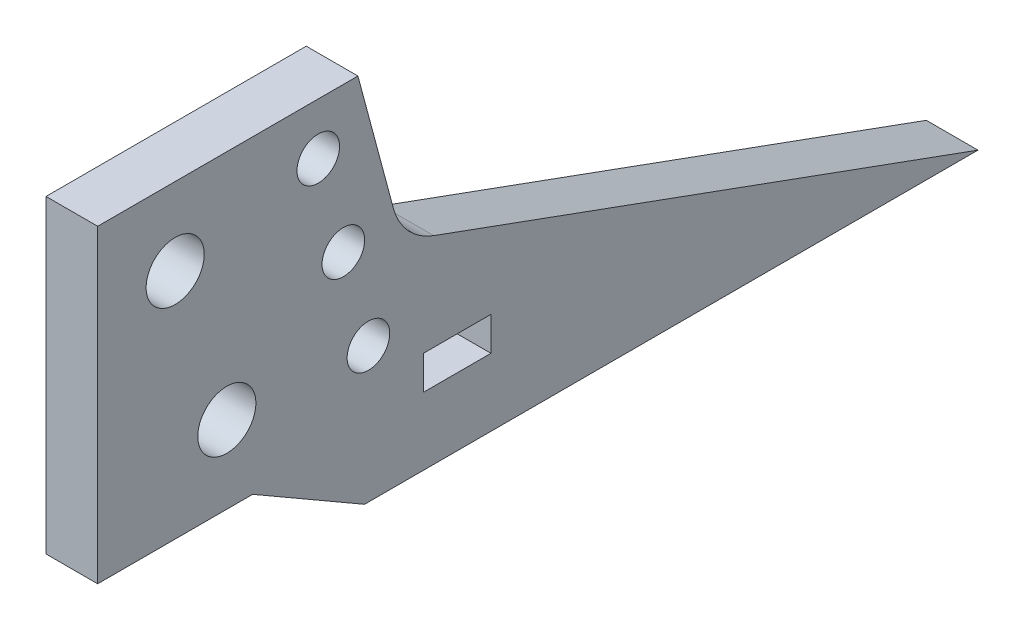
ISO-10303-21;
HEADER;
FILE_DESCRIPTION(('STEP AP214'),'2;1');
FILE_NAME('part.step','',(''),(''),'','','');
FILE_SCHEMA(('AUTOMOTIVE_DESIGN { 1 0 10303 214 1 1 1 1 }'));
ENDSEC;
DATA;
#1=APPLICATION_CONTEXT('core data for automotive mechanical design processes');
#2=APPLICATION_PROTOCOL_DEFINITION('international standard','automotive_design',2000,#1);
#3=PRODUCT_CONTEXT('',#1,'mechanical');
#4=PRODUCT('Part','Part','',(#3));
#5=PRODUCT_RELATED_PRODUCT_CATEGORY('part','',(#4));
#6=PRODUCT_DEFINITION_FORMATION('','',#4);
#7=PRODUCT_DEFINITION_CONTEXT('part definition',#1,'design');
#8=PRODUCT_DEFINITION('design','',#6,#7);
#9=PRODUCT_DEFINITION_SHAPE('','',#8);
#10=(LENGTH_UNIT() NAMED_UNIT(*) SI_UNIT(.MILLI.,.METRE.));
#11=(NAMED_UNIT(*) PLANE_ANGLE_UNIT() SI_UNIT($,.RADIAN.));
#12=(NAMED_UNIT(*) SI_UNIT($,.STERADIAN.) SOLID_ANGLE_UNIT());
#13=UNCERTAINTY_MEASURE_WITH_UNIT(LENGTH_MEASURE(1.E-05),#10,'distance_accuracy_value','');
#14=(GEOMETRIC_REPRESENTATION_CONTEXT(3) GLOBAL_UNCERTAINTY_ASSIGNED_CONTEXT((#13)) GLOBAL_UNIT_ASSIGNED_CONTEXT((#10,
#11,#12)) REPRESENTATION_CONTEXT('',''));
#15=CARTESIAN_POINT('',(0.,0.,0.));
#16=DIRECTION('',(0.,0.,1.));
#17=DIRECTION('',(1.,0.,0.));
#18=AXIS2_PLACEMENT_3D('',#15,#16,#17);
#19=CARTESIAN_POINT('',(8.,10.,-16.));
#20=DIRECTION('',(0.,1.,0.));
#21=DIRECTION('',(0.,0.,1.));
#22=AXIS2_PLACEMENT_3D('',#19,#20,#21);
#23=PLANE('',#22);
#24=DIRECTION('',(0.,0.,-1.));
#25=VECTOR('',#24,1.);
#26=CARTESIAN_POINT('',(0.,10.,-16.));
#27=LINE('',#26,#25);
#28=CARTESIAN_POINT('',(0.,9.99999999999999,7.99999999999999));
#29=VERTEX_POINT('',#28);
#30=CARTESIAN_POINT('',(0.,10.,-16.));
#31=VERTEX_POINT('',#30);
#32=EDGE_CURVE('E238',#29,#31,#27,.T.);
#33=ORIENTED_EDGE('',*,*,#32,.T.);
#34=DIRECTION('',(-1.,0.,0.));
#35=VECTOR('',#34,1.);
#36=CARTESIAN_POINT('',(8.,10.,-16.));
#37=LINE('',#36,#35);
#38=CARTESIAN_POINT('',(8.,10.,-16.));
#39=VERTEX_POINT('',#38);
#40=EDGE_CURVE('E278',#39,#31,#37,.T.);
#41=ORIENTED_EDGE('',*,*,#40,.F.);
#42=DIRECTION('',(0.,0.,-1.));
#43=VECTOR('',#42,1.);
#44=CARTESIAN_POINT('',(8.,10.,-16.));
#45=LINE('',#44,#43);
#46=CARTESIAN_POINT('',(8.,9.99999999999999,7.99999999999999));
#47=VERTEX_POINT('',#46);
#48=EDGE_CURVE('E239',#47,#39,#45,.T.);
#49=ORIENTED_EDGE('',*,*,#48,.F.);
#50=DIRECTION('',(1.,0.,0.));
#51=VECTOR('',#50,1.);
#52=CARTESIAN_POINT('',(-48.6149330272285,9.99999999999999,7.99999999999999));
#53=LINE('',#52,#51);
#54=EDGE_CURVE('E219',#29,#47,#53,.T.);
#55=ORIENTED_EDGE('',*,*,#54,.F.);
#56=EDGE_LOOP('',(#33,#41,#49,#55));
#57=FACE_BOUND('',#56,.T.);
#58=ADVANCED_FACE('F45',(#57),#23,.F.);
#59=CARTESIAN_POINT('',(8.,0.,-33.3205080756887));
#60=DIRECTION('',(0.,0.866025403784438,-0.500000000000001));
#61=DIRECTION('',(0.,0.500000000000001,0.866025403784438));
#62=AXIS2_PLACEMENT_3D('',#59,#60,#61);
#63=PLANE('',#62);
#64=DIRECTION('',(0.,-0.500000000000001,-0.866025403784438));
#65=VECTOR('',#64,1.);
#66=CARTESIAN_POINT('',(0.,0.,-33.3205080756887));
#67=LINE('',#66,#65);
#68=CARTESIAN_POINT('',(0.,0.,-33.3205080756887));
#69=VERTEX_POINT('',#68);
#70=EDGE_CURVE('E259',#31,#69,#67,.T.);
#71=ORIENTED_EDGE('',*,*,#70,.T.);
#72=DIRECTION('',(-1.,0.,0.));
#73=VECTOR('',#72,1.);
#74=CARTESIAN_POINT('',(8.,0.,-33.3205080756887));
#75=LINE('',#74,#73);
#76=CARTESIAN_POINT('',(8.,0.,-33.3205080756887));
#77=VERTEX_POINT('',#76);
#78=EDGE_CURVE('E274',#77,#69,#75,.T.);
#79=ORIENTED_EDGE('',*,*,#78,.F.);
#80=DIRECTION('',(0.,-0.500000000000001,-0.866025403784438));
#81=VECTOR('',#80,1.);
#82=CARTESIAN_POINT('',(8.,0.,-33.3205080756887));
#83=LINE('',#82,#81);
#84=EDGE_CURVE('E242',#39,#77,#83,.T.);
#85=ORIENTED_EDGE('',*,*,#84,.F.);
#86=ORIENTED_EDGE('',*,*,#40,.T.);
#87=EDGE_LOOP('',(#71,#79,#85,#86));
#88=FACE_BOUND('',#87,.T.);
#89=ADVANCED_FACE('F322',(#88),#63,.F.);
#90=CARTESIAN_POINT('',(8.,0.,-33.3205080756887));
#91=DIRECTION('',(0.,1.,0.));
#92=DIRECTION('',(0.,0.,1.));
#93=AXIS2_PLACEMENT_3D('',#90,#91,#92);
#94=PLANE('',#93);
#95=DIRECTION('',(0.,0.,-1.));
#96=VECTOR('',#95,1.);
#97=CARTESIAN_POINT('',(0.,0.,-33.3205080756887));
#98=LINE('',#97,#96);
#99=CARTESIAN_POINT('',(0.,0.,-128.320508075689));
#100=VERTEX_POINT('',#99);
#101=EDGE_CURVE('E262',#69,#100,#98,.T.);
#102=ORIENTED_EDGE('',*,*,#101,.T.);
#103=DIRECTION('',(-1.,0.,0.));
#104=VECTOR('',#103,1.);
#105=CARTESIAN_POINT('',(8.,0.,-128.320508075689));
#106=LINE('',#105,#104);
#107=CARTESIAN_POINT('',(8.,0.,-128.320508075689));
#108=VERTEX_POINT('',#107);
#109=EDGE_CURVE('E256',#108,#100,#106,.T.);
#110=ORIENTED_EDGE('',*,*,#109,.F.);
#111=DIRECTION('',(0.,0.,-1.));
#112=VECTOR('',#111,1.);
#113=CARTESIAN_POINT('',(8.,0.,-33.3205080756887));
#114=LINE('',#113,#112);
#115=EDGE_CURVE('E246',#77,#108,#114,.T.);
#116=ORIENTED_EDGE('',*,*,#115,.F.);
#117=ORIENTED_EDGE('',*,*,#78,.T.);
#118=EDGE_LOOP('',(#102,#110,#116,#117));
#119=FACE_BOUND('',#118,.T.);
#120=ADVANCED_FACE('F325',(#119),#94,.F.);
#121=CARTESIAN_POINT('',(8.,0.,-128.320508075689));
#122=DIRECTION('',(0.,-0.939692620785911,0.342020143325663));
#123=DIRECTION('',(0.,-0.342020143325663,-0.939692620785911));
#124=AXIS2_PLACEMENT_3D('',#121,#122,#123);
#125=PLANE('',#124);
#126=DIRECTION('',(0.,0.342020143325663,0.939692620785911));
#127=VECTOR('',#126,1.);
#128=CARTESIAN_POINT('',(0.,0.,-128.320508075689));
#129=LINE('',#128,#127);
#130=CARTESIAN_POINT('',(0.,30.6822908586107,-44.0216067645152));
#131=VERTEX_POINT('',#130);
#132=EDGE_CURVE('E265',#100,#131,#129,.T.);
#133=ORIENTED_EDGE('',*,*,#132,.T.);
#134=DIRECTION('',(-1.,0.,0.));
#135=VECTOR('',#134,1.);
#136=CARTESIAN_POINT('',(8.,30.6822908586107,-44.0216067645152));
#137=LINE('',#136,#135);
#138=CARTESIAN_POINT('',(8.,30.6822908586107,-44.0216067645152));
#139=VERTEX_POINT('',#138);
#140=EDGE_CURVE('E286',#131,#139,#137,.F.);
#141=ORIENTED_EDGE('',*,*,#140,.T.);
#142=DIRECTION('',(0.,0.342020143325663,0.939692620785911));
#143=VECTOR('',#142,1.);
#144=CARTESIAN_POINT('',(8.,0.,-128.320508075689));
#145=LINE('',#144,#143);
#146=EDGE_CURVE('E249',#108,#139,#145,.T.);
#147=ORIENTED_EDGE('',*,*,#146,.F.);
#148=ORIENTED_EDGE('',*,*,#109,.T.);
#149=EDGE_LOOP('',(#133,#141,#147,#148));
#150=FACE_BOUND('',#149,.T.);
#151=ADVANCED_FACE('F298',(#150),#125,.F.);
#152=CARTESIAN_POINT('',(8.,74.,-28.));
#153=DIRECTION('',(0.,-0.258819045102525,0.965925826289067));
#154=DIRECTION('',(0.,-0.965925826289067,-0.258819045102525));
#155=AXIS2_PLACEMENT_3D('',#152,#153,#154);
#156=PLANE('',#155);
#157=DIRECTION('',(0.,0.965925826289067,0.258819045102525));
#158=VECTOR('',#157,1.);
#159=CARTESIAN_POINT('',(8.,74.,-28.));
#160=LINE('',#159,#158);
#161=CARTESIAN_POINT('',(8.,37.4910266154445,-37.7825499348812));
#162=VERTEX_POINT('',#161);
#163=CARTESIAN_POINT('',(8.,57.9521815274541,-32.3));
#164=VERTEX_POINT('',#163);
#165=EDGE_CURVE('E253',#162,#164,#160,.T.);
#166=ORIENTED_EDGE('',*,*,#165,.F.);
#167=DIRECTION('',(-1.,0.,0.));
#168=VECTOR('',#167,1.);
#169=CARTESIAN_POINT('',(0.,37.4910266154445,-37.7825499348812));
#170=LINE('',#169,#168);
#171=CARTESIAN_POINT('',(0.,37.4910266154445,-37.7825499348812));
#172=VERTEX_POINT('',#171);
#173=EDGE_CURVE('E282',#162,#172,#170,.T.);
#174=ORIENTED_EDGE('',*,*,#173,.T.);
#175=DIRECTION('',(0.,0.965925826289067,0.258819045102525));
#176=VECTOR('',#175,1.);
#177=CARTESIAN_POINT('',(0.,74.,-28.));
#178=LINE('',#177,#176);
#179=CARTESIAN_POINT('',(0.,57.9521815274541,-32.3));
#180=VERTEX_POINT('',#179);
#181=EDGE_CURVE('E243',#172,#180,#178,.T.);
#182=ORIENTED_EDGE('',*,*,#181,.T.);
#183=DIRECTION('',(1.,0.,0.));
#184=VECTOR('',#183,1.);
#185=CARTESIAN_POINT('',(0.,57.9521815274541,-32.3));
#186=LINE('',#185,#184);
#187=EDGE_CURVE('E231',#180,#164,#186,.T.);
#188=ORIENTED_EDGE('',*,*,#187,.T.);
#189=EDGE_LOOP('',(#166,#174,#182,#188));
#190=FACE_BOUND('',#189,.T.);
#191=ADVANCED_FACE('F306',(#190),#156,.F.);
#192=CARTESIAN_POINT('',(8.,0.,0.));
#193=DIRECTION('',(-1.,0.,0.));
#194=DIRECTION('',(0.,0.,1.));
#195=AXIS2_PLACEMENT_3D('',#192,#193,#194);
#196=PLANE('',#195);
#197=DIRECTION('',(0.,0.,-1.));
#198=VECTOR('',#197,1.);
#199=CARTESIAN_POINT('',(8.,10.4639018828817,-42.4466301675452));
#200=LINE('',#199,#198);
#201=CARTESIAN_POINT('',(8.,10.4639018828817,-42.4466301675452));
#202=VERTEX_POINT('',#201);
#203=CARTESIAN_POINT('',(8.,10.4639018828817,-52.9005721237873));
#204=VERTEX_POINT('',#203);
#205=EDGE_CURVE('E161',#202,#204,#200,.T.);
#206=ORIENTED_EDGE('',*,*,#205,.F.);
#207=DIRECTION('',(0.,-1.,0.));
#208=VECTOR('',#207,1.);
#209=CARTESIAN_POINT('',(8.,10.4639018828817,-42.4466301675452));
#210=LINE('',#209,#208);
#211=CARTESIAN_POINT('',(8.,15.6908728610027,-42.4466301675452));
#212=VERTEX_POINT('',#211);
#213=EDGE_CURVE('E61',#212,#202,#210,.T.);
#214=ORIENTED_EDGE('',*,*,#213,.F.);
#215=DIRECTION('',(0.,0.,1.));
#216=VECTOR('',#215,1.);
#217=CARTESIAN_POINT('',(8.,15.6908728610027,-42.4466301675452));
#218=LINE('',#217,#216);
#219=CARTESIAN_POINT('',(8.,15.6908728610027,-52.9005721237873));
#220=VERTEX_POINT('',#219);
#221=EDGE_CURVE('E152',#220,#212,#218,.T.);
#222=ORIENTED_EDGE('',*,*,#221,.F.);
#223=DIRECTION('',(0.,1.,0.));
#224=VECTOR('',#223,1.);
#225=CARTESIAN_POINT('',(8.,10.4639018828817,-52.9005721237873));
#226=LINE('',#225,#224);
#227=EDGE_CURVE('E155',#204,#220,#226,.T.);
#228=ORIENTED_EDGE('',*,*,#227,.F.);
#229=EDGE_LOOP('',(#206,#214,#222,#228));
#230=FACE_BOUND('',#229,.T.);
#231=CARTESIAN_POINT('',(8.,49.9521815274541,-26.1613840961684));
#232=DIRECTION('',(1.,0.,0.));
#233=DIRECTION('',(0.,0.,-1.));
#234=AXIS2_PLACEMENT_3D('',#231,#232,#233);
#235=CIRCLE('',#234,3.3);
#236=CARTESIAN_POINT('',(8.,49.9521815274541,-29.4613840961684));
#237=VERTEX_POINT('',#236);
#238=EDGE_CURVE('E167',#237,#237,#235,.T.);
#239=ORIENTED_EDGE('',*,*,#238,.F.);
#240=EDGE_LOOP('',(#239));
#241=FACE_BOUND('',#240,.T.);
#242=CARTESIAN_POINT('',(8.,35.4632941331181,-30.0436697727062));
#243=DIRECTION('',(1.,0.,0.));
#244=DIRECTION('',(0.,0.,-1.));
#245=AXIS2_PLACEMENT_3D('',#242,#243,#244);
#246=CIRCLE('',#245,3.3);
#247=CARTESIAN_POINT('',(8.,35.4632941331181,-33.3436697727062));
#248=VERTEX_POINT('',#247);
#249=EDGE_CURVE('E178',#248,#248,#246,.T.);
#250=ORIENTED_EDGE('',*,*,#249,.F.);
#251=EDGE_LOOP('',(#250));
#252=FACE_BOUND('',#251,.T.);
#253=CARTESIAN_POINT('',(8.,20.9744067387821,-33.925955449244));
#254=DIRECTION('',(1.,0.,0.));
#255=DIRECTION('',(0.,0.,-1.));
#256=AXIS2_PLACEMENT_3D('',#253,#254,#255);
#257=CIRCLE('',#256,3.3);
#258=CARTESIAN_POINT('',(8.,20.9744067387821,-37.225955449244));
#259=VERTEX_POINT('',#258);
#260=EDGE_CURVE('E186',#259,#259,#257,.T.);
#261=ORIENTED_EDGE('',*,*,#260,.F.);
#262=EDGE_LOOP('',(#261));
#263=FACE_BOUND('',#262,.T.);
#264=CARTESIAN_POINT('',(8.,45.9521815274541,-4.));
#265=DIRECTION('',(-1.,0.,0.));
#266=DIRECTION('',(0.,0.,1.));
#267=AXIS2_PLACEMENT_3D('',#264,#265,#266);
#268=CIRCLE('',#267,4.5);
#269=CARTESIAN_POINT('',(8.,45.9521815274541,0.499999999999995));
#270=VERTEX_POINT('',#269);
#271=EDGE_CURVE('E198',#270,#270,#268,.T.);
#272=ORIENTED_EDGE('',*,*,#271,.T.);
#273=EDGE_LOOP('',(#272));
#274=FACE_BOUND('',#273,.T.);
#275=CARTESIAN_POINT('',(8.,22.,-12.));
#276=DIRECTION('',(-1.,0.,0.));
#277=DIRECTION('',(0.,0.,1.));
#278=AXIS2_PLACEMENT_3D('',#275,#276,#277);
#279=CIRCLE('',#278,4.5);
#280=CARTESIAN_POINT('',(8.,22.,-7.5));
#281=VERTEX_POINT('',#280);
#282=EDGE_CURVE('E206',#281,#281,#279,.T.);
#283=ORIENTED_EDGE('',*,*,#282,.T.);
#284=EDGE_LOOP('',(#283));
#285=FACE_BOUND('',#284,.T.);
#286=ORIENTED_EDGE('',*,*,#146,.T.);
#287=CARTESIAN_POINT('',(8.,40.0792170664698,-47.4418081977718));
#288=DIRECTION('',(-1.,0.,0.));
#289=DIRECTION('',(0.,0.,1.));
#290=AXIS2_PLACEMENT_3D('',#287,#288,#289);
#291=CIRCLE('',#290,10.);
#292=EDGE_CURVE('E11',#139,#162,#291,.T.);
#293=ORIENTED_EDGE('',*,*,#292,.T.);
#294=ORIENTED_EDGE('',*,*,#165,.T.);
#295=DIRECTION('',(0.,0.,-1.));
#296=VECTOR('',#295,1.);
#297=CARTESIAN_POINT('',(8.,57.9521815274541,0.));
#298=LINE('',#297,#296);
#299=CARTESIAN_POINT('',(8.,57.9521815274541,8.));
#300=VERTEX_POINT('',#299);
#301=EDGE_CURVE('E223',#300,#164,#298,.T.);
#302=ORIENTED_EDGE('',*,*,#301,.F.);
#303=DIRECTION('',(0.,-1.,0.));
#304=VECTOR('',#303,1.);
#305=CARTESIAN_POINT('',(8.,57.9521815274541,8.));
#306=LINE('',#305,#304);
#307=EDGE_CURVE('E210',#300,#47,#306,.T.);
#308=ORIENTED_EDGE('',*,*,#307,.T.);
#309=ORIENTED_EDGE('',*,*,#48,.T.);
#310=ORIENTED_EDGE('',*,*,#84,.T.);
#311=ORIENTED_EDGE('',*,*,#115,.T.);
#312=EDGE_LOOP('',(#286,#293,#294,#302,#308,#309,#310,#311));
#313=FACE_BOUND('',#312,.T.);
#314=ADVANCED_FACE('F304',(#230,#241,#252,#263,#274,#285,#313),#196,.F.);
#315=CARTESIAN_POINT('',(0.,0.,0.));
#316=DIRECTION('',(-1.,0.,0.));
#317=DIRECTION('',(0.,0.,1.));
#318=AXIS2_PLACEMENT_3D('',#315,#316,#317);
#319=PLANE('',#318);
#320=DIRECTION('',(0.,-1.,0.));
#321=VECTOR('',#320,1.);
#322=CARTESIAN_POINT('',(0.,10.4639018828817,-42.4466301675452));
#323=LINE('',#322,#321);
#324=CARTESIAN_POINT('',(0.,15.6908728610027,-42.4466301675452));
#325=VERTEX_POINT('',#324);
#326=CARTESIAN_POINT('',(0.,10.4639018828817,-42.4466301675452));
#327=VERTEX_POINT('',#326);
#328=EDGE_CURVE('E136',#325,#327,#323,.T.);
#329=ORIENTED_EDGE('',*,*,#328,.T.);
#330=DIRECTION('',(0.,0.,-1.));
#331=VECTOR('',#330,1.);
#332=CARTESIAN_POINT('',(0.,10.4639018828817,-42.4466301675452));
#333=LINE('',#332,#331);
#334=CARTESIAN_POINT('',(0.,10.4639018828817,-52.9005721237873));
#335=VERTEX_POINT('',#334);
#336=EDGE_CURVE('E145',#327,#335,#333,.T.);
#337=ORIENTED_EDGE('',*,*,#336,.T.);
#338=DIRECTION('',(0.,1.,0.));
#339=VECTOR('',#338,1.);
#340=CARTESIAN_POINT('',(0.,10.4639018828817,-52.9005721237873));
#341=LINE('',#340,#339);
#342=CARTESIAN_POINT('',(0.,15.6908728610027,-52.9005721237873));
#343=VERTEX_POINT('',#342);
#344=EDGE_CURVE('E69',#335,#343,#341,.T.);
#345=ORIENTED_EDGE('',*,*,#344,.T.);
#346=DIRECTION('',(0.,0.,1.));
#347=VECTOR('',#346,1.);
#348=CARTESIAN_POINT('',(0.,15.6908728610027,-42.4466301675452));
#349=LINE('',#348,#347);
#350=EDGE_CURVE('E142',#343,#325,#349,.T.);
#351=ORIENTED_EDGE('',*,*,#350,.T.);
#352=EDGE_LOOP('',(#329,#337,#345,#351));
#353=FACE_BOUND('',#352,.T.);
#354=CARTESIAN_POINT('',(0.,49.9521815274541,-26.1613840961684));
#355=DIRECTION('',(1.,0.,0.));
#356=DIRECTION('',(0.,0.,-1.));
#357=AXIS2_PLACEMENT_3D('',#354,#355,#356);
#358=CIRCLE('',#357,3.3);
#359=CARTESIAN_POINT('',(0.,49.9521815274541,-29.4613840961684));
#360=VERTEX_POINT('',#359);
#361=EDGE_CURVE('E174',#360,#360,#358,.T.);
#362=ORIENTED_EDGE('',*,*,#361,.T.);
#363=EDGE_LOOP('',(#362));
#364=FACE_BOUND('',#363,.T.);
#365=CARTESIAN_POINT('',(0.,35.4632941331181,-30.0436697727062));
#366=DIRECTION('',(1.,0.,0.));
#367=DIRECTION('',(0.,0.,-1.));
#368=AXIS2_PLACEMENT_3D('',#365,#366,#367);
#369=CIRCLE('',#368,3.3);
#370=CARTESIAN_POINT('',(0.,35.4632941331181,-33.3436697727062));
#371=VERTEX_POINT('',#370);
#372=EDGE_CURVE('E182',#371,#371,#369,.T.);
#373=ORIENTED_EDGE('',*,*,#372,.T.);
#374=EDGE_LOOP('',(#373));
#375=FACE_BOUND('',#374,.T.);
#376=CARTESIAN_POINT('',(0.,20.9744067387821,-33.925955449244));
#377=DIRECTION('',(1.,0.,0.));
#378=DIRECTION('',(0.,0.,-1.));
#379=AXIS2_PLACEMENT_3D('',#376,#377,#378);
#380=CIRCLE('',#379,3.3);
#381=CARTESIAN_POINT('',(0.,20.9744067387821,-37.225955449244));
#382=VERTEX_POINT('',#381);
#383=EDGE_CURVE('E190',#382,#382,#380,.T.);
#384=ORIENTED_EDGE('',*,*,#383,.T.);
#385=EDGE_LOOP('',(#384));
#386=FACE_BOUND('',#385,.T.);
#387=CARTESIAN_POINT('',(0.,45.9521815274541,-4.));
#388=DIRECTION('',(-1.,0.,0.));
#389=DIRECTION('',(0.,0.,1.));
#390=AXIS2_PLACEMENT_3D('',#387,#388,#389);
#391=CIRCLE('',#390,4.49999999999999);
#392=CARTESIAN_POINT('',(0.,45.9521815274541,0.499999999999988));
#393=VERTEX_POINT('',#392);
#394=EDGE_CURVE('E194',#393,#393,#391,.T.);
#395=ORIENTED_EDGE('',*,*,#394,.F.);
#396=EDGE_LOOP('',(#395));
#397=FACE_BOUND('',#396,.T.);
#398=CARTESIAN_POINT('',(0.,22.,-12.));
#399=DIRECTION('',(-1.,0.,0.));
#400=DIRECTION('',(0.,0.,1.));
#401=AXIS2_PLACEMENT_3D('',#398,#399,#400);
#402=CIRCLE('',#401,4.49999999999999);
#403=CARTESIAN_POINT('',(0.,22.,-7.50000000000001));
#404=VERTEX_POINT('',#403);
#405=EDGE_CURVE('E202',#404,#404,#402,.T.);
#406=ORIENTED_EDGE('',*,*,#405,.F.);
#407=EDGE_LOOP('',(#406));
#408=FACE_BOUND('',#407,.T.);
#409=DIRECTION('',(0.,0.,-1.));
#410=VECTOR('',#409,1.);
#411=CARTESIAN_POINT('',(0.,57.9521815274541,0.));
#412=LINE('',#411,#410);
#413=CARTESIAN_POINT('',(0.,57.9521815274541,8.));
#414=VERTEX_POINT('',#413);
#415=EDGE_CURVE('E227',#414,#180,#412,.T.);
#416=ORIENTED_EDGE('',*,*,#415,.T.);
#417=ORIENTED_EDGE('',*,*,#181,.F.);
#418=CARTESIAN_POINT('',(0.,40.0792170664698,-47.4418081977718));
#419=DIRECTION('',(-1.,0.,0.));
#420=DIRECTION('',(0.,0.,1.));
#421=AXIS2_PLACEMENT_3D('',#418,#419,#420);
#422=CIRCLE('',#421,10.);
#423=EDGE_CURVE('E54',#172,#131,#422,.F.);
#424=ORIENTED_EDGE('',*,*,#423,.T.);
#425=ORIENTED_EDGE('',*,*,#132,.F.);
#426=ORIENTED_EDGE('',*,*,#101,.F.);
#427=ORIENTED_EDGE('',*,*,#70,.F.);
#428=ORIENTED_EDGE('',*,*,#32,.F.);
#429=DIRECTION('',(0.,-1.,0.));
#430=VECTOR('',#429,1.);
#431=CARTESIAN_POINT('',(0.,57.9521815274541,8.));
#432=LINE('',#431,#430);
#433=EDGE_CURVE('E215',#414,#29,#432,.T.);
#434=ORIENTED_EDGE('',*,*,#433,.F.);
#435=EDGE_LOOP('',(#416,#417,#424,#425,#426,#427,#428,#434));
#436=FACE_BOUND('',#435,.T.);
#437=ADVANCED_FACE('F149',(#353,#364,#375,#386,#397,#408,#436),#319,.T.);
#438=CARTESIAN_POINT('',(0.,57.9521815274541,0.));
#439=DIRECTION('',(0.,-1.,0.));
#440=DIRECTION('',(0.,0.,-1.));
#441=AXIS2_PLACEMENT_3D('',#438,#439,#440);
#442=PLANE('',#441);
#443=ORIENTED_EDGE('',*,*,#301,.T.);
#444=ORIENTED_EDGE('',*,*,#187,.F.);
#445=ORIENTED_EDGE('',*,*,#415,.F.);
#446=DIRECTION('',(1.,0.,0.));
#447=VECTOR('',#446,1.);
#448=CARTESIAN_POINT('',(-48.6149330272285,57.9521815274541,8.));
#449=LINE('',#448,#447);
#450=EDGE_CURVE('E214',#414,#300,#449,.T.);
#451=ORIENTED_EDGE('',*,*,#450,.T.);
#452=EDGE_LOOP('',(#443,#444,#445,#451));
#453=FACE_BOUND('',#452,.T.);
#454=ADVANCED_FACE('F309',(#453),#442,.F.);
#455=CARTESIAN_POINT('',(-48.6149330272285,57.9521815274541,8.));
#456=DIRECTION('',(0.,0.,1.));
#457=DIRECTION('',(0.,-1.,0.));
#458=AXIS2_PLACEMENT_3D('',#455,#456,#457);
#459=PLANE('',#458);
#460=ORIENTED_EDGE('',*,*,#450,.F.);
#461=ORIENTED_EDGE('',*,*,#433,.T.);
#462=ORIENTED_EDGE('',*,*,#54,.T.);
#463=ORIENTED_EDGE('',*,*,#307,.F.);
#464=EDGE_LOOP('',(#460,#461,#462,#463));
#465=FACE_BOUND('',#464,.T.);
#466=ADVANCED_FACE('F316',(#465),#459,.T.);
#467=CARTESIAN_POINT('',(0.,22.,-12.));
#468=DIRECTION('',(-1.,0.,0.));
#469=DIRECTION('',(0.,0.,1.));
#470=AXIS2_PLACEMENT_3D('',#467,#468,#469);
#471=CYLINDRICAL_SURFACE('',#470,4.49999999999999);
#472=ORIENTED_EDGE('',*,*,#282,.F.);
#473=EDGE_LOOP('',(#472));
#474=FACE_BOUND('',#473,.T.);
#475=ORIENTED_EDGE('',*,*,#405,.T.);
#476=EDGE_LOOP('',(#475));
#477=FACE_BOUND('',#476,.T.);
#478=ADVANCED_FACE('F386',(#474,#477),#471,.F.);
#479=CARTESIAN_POINT('',(0.,45.9521815274541,-4.));
#480=DIRECTION('',(-1.,0.,0.));
#481=DIRECTION('',(0.,0.,1.));
#482=AXIS2_PLACEMENT_3D('',#479,#480,#481);
#483=CYLINDRICAL_SURFACE('',#482,4.49999999999999);
#484=ORIENTED_EDGE('',*,*,#271,.F.);
#485=EDGE_LOOP('',(#484));
#486=FACE_BOUND('',#485,.T.);
#487=ORIENTED_EDGE('',*,*,#394,.T.);
#488=EDGE_LOOP('',(#487));
#489=FACE_BOUND('',#488,.T.);
#490=ADVANCED_FACE('F394',(#486,#489),#483,.F.);
#491=CARTESIAN_POINT('',(8.,20.9744067387821,-33.925955449244));
#492=DIRECTION('',(1.,0.,0.));
#493=DIRECTION('',(0.,0.,-1.));
#494=AXIS2_PLACEMENT_3D('',#491,#492,#493);
#495=CYLINDRICAL_SURFACE('',#494,3.3);
#496=ORIENTED_EDGE('',*,*,#383,.F.);
#497=EDGE_LOOP('',(#496));
#498=FACE_BOUND('',#497,.T.);
#499=ORIENTED_EDGE('',*,*,#260,.T.);
#500=EDGE_LOOP('',(#499));
#501=FACE_BOUND('',#500,.T.);
#502=ADVANCED_FACE('F403',(#498,#501),#495,.F.);
#503=CARTESIAN_POINT('',(8.,35.4632941331181,-30.0436697727062));
#504=DIRECTION('',(1.,0.,0.));
#505=DIRECTION('',(0.,0.,-1.));
#506=AXIS2_PLACEMENT_3D('',#503,#504,#505);
#507=CYLINDRICAL_SURFACE('',#506,3.3);
#508=ORIENTED_EDGE('',*,*,#372,.F.);
#509=EDGE_LOOP('',(#508));
#510=FACE_BOUND('',#509,.T.);
#511=ORIENTED_EDGE('',*,*,#249,.T.);
#512=EDGE_LOOP('',(#511));
#513=FACE_BOUND('',#512,.T.);
#514=ADVANCED_FACE('F412',(#510,#513),#507,.F.);
#515=CARTESIAN_POINT('',(8.,49.9521815274541,-26.1613840961684));
#516=DIRECTION('',(1.,0.,0.));
#517=DIRECTION('',(0.,0.,-1.));
#518=AXIS2_PLACEMENT_3D('',#515,#516,#517);
#519=CYLINDRICAL_SURFACE('',#518,3.3);
#520=ORIENTED_EDGE('',*,*,#361,.F.);
#521=EDGE_LOOP('',(#520));
#522=FACE_BOUND('',#521,.T.);
#523=ORIENTED_EDGE('',*,*,#238,.T.);
#524=EDGE_LOOP('',(#523));
#525=FACE_BOUND('',#524,.T.);
#526=ADVANCED_FACE('F421',(#522,#525),#519,.F.);
#527=CARTESIAN_POINT('',(8.,40.0792170664698,-47.4418081977718));
#528=DIRECTION('',(1.,0.,0.));
#529=DIRECTION('',(0.,0.,-1.));
#530=AXIS2_PLACEMENT_3D('',#527,#528,#529);
#531=CYLINDRICAL_SURFACE('',#530,10.);
#532=ORIENTED_EDGE('',*,*,#292,.F.);
#533=ORIENTED_EDGE('',*,*,#140,.F.);
#534=ORIENTED_EDGE('',*,*,#423,.F.);
#535=ORIENTED_EDGE('',*,*,#173,.F.);
#536=EDGE_LOOP('',(#532,#533,#534,#535));
#537=FACE_BOUND('',#536,.T.);
#538=ADVANCED_FACE('F47',(#537),#531,.F.);
#539=CARTESIAN_POINT('',(0.,10.4639018828817,-42.4466301675452));
#540=DIRECTION('',(0.,0.,1.));
#541=DIRECTION('',(1.,0.,0.));
#542=AXIS2_PLACEMENT_3D('',#539,#540,#541);
#543=PLANE('',#542);
#544=ORIENTED_EDGE('',*,*,#213,.T.);
#545=DIRECTION('',(1.,0.,0.));
#546=VECTOR('',#545,1.);
#547=CARTESIAN_POINT('',(0.,10.4639018828817,-42.4466301675452));
#548=LINE('',#547,#546);
#549=EDGE_CURVE('E132',#327,#202,#548,.T.);
#550=ORIENTED_EDGE('',*,*,#549,.F.);
#551=ORIENTED_EDGE('',*,*,#328,.F.);
#552=DIRECTION('',(1.,0.,0.));
#553=VECTOR('',#552,1.);
#554=CARTESIAN_POINT('',(0.,15.6908728610027,-42.4466301675452));
#555=LINE('',#554,#553);
#556=EDGE_CURVE('E165',#325,#212,#555,.T.);
#557=ORIENTED_EDGE('',*,*,#556,.T.);
#558=EDGE_LOOP('',(#544,#550,#551,#557));
#559=FACE_BOUND('',#558,.T.);
#560=ADVANCED_FACE('F134',(#559),#543,.F.);
#561=CARTESIAN_POINT('',(0.,15.6908728610027,-42.4466301675452));
#562=DIRECTION('',(0.,1.,0.));
#563=DIRECTION('',(0.,0.,1.));
#564=AXIS2_PLACEMENT_3D('',#561,#562,#563);
#565=PLANE('',#564);
#566=ORIENTED_EDGE('',*,*,#221,.T.);
#567=ORIENTED_EDGE('',*,*,#556,.F.);
#568=ORIENTED_EDGE('',*,*,#350,.F.);
#569=DIRECTION('',(1.,0.,0.));
#570=VECTOR('',#569,1.);
#571=CARTESIAN_POINT('',(0.,15.6908728610027,-52.9005721237873));
#572=LINE('',#571,#570);
#573=EDGE_CURVE('E168',#343,#220,#572,.T.);
#574=ORIENTED_EDGE('',*,*,#573,.T.);
#575=EDGE_LOOP('',(#566,#567,#568,#574));
#576=FACE_BOUND('',#575,.T.);
#577=ADVANCED_FACE('F444',(#576),#565,.F.);
#578=CARTESIAN_POINT('',(0.,10.4639018828817,-52.9005721237873));
#579=DIRECTION('',(0.,0.,-1.));
#580=DIRECTION('',(-1.,0.,0.));
#581=AXIS2_PLACEMENT_3D('',#578,#579,#580);
#582=PLANE('',#581);
#583=ORIENTED_EDGE('',*,*,#227,.T.);
#584=ORIENTED_EDGE('',*,*,#573,.F.);
#585=ORIENTED_EDGE('',*,*,#344,.F.);
#586=DIRECTION('',(1.,0.,0.));
#587=VECTOR('',#586,1.);
#588=CARTESIAN_POINT('',(0.,10.4639018828817,-52.9005721237873));
#589=LINE('',#588,#587);
#590=EDGE_CURVE('E141',#335,#204,#589,.T.);
#591=ORIENTED_EDGE('',*,*,#590,.T.);
#592=EDGE_LOOP('',(#583,#584,#585,#591));
#593=FACE_BOUND('',#592,.T.);
#594=ADVANCED_FACE('F451',(#593),#582,.F.);
#595=CARTESIAN_POINT('',(0.,10.4639018828817,-42.4466301675452));
#596=DIRECTION('',(0.,-1.,0.));
#597=DIRECTION('',(0.,0.,-1.));
#598=AXIS2_PLACEMENT_3D('',#595,#596,#597);
#599=PLANE('',#598);
#600=ORIENTED_EDGE('',*,*,#205,.T.);
#601=ORIENTED_EDGE('',*,*,#590,.F.);
#602=ORIENTED_EDGE('',*,*,#336,.F.);
#603=ORIENTED_EDGE('',*,*,#549,.T.);
#604=EDGE_LOOP('',(#600,#601,#602,#603));
#605=FACE_BOUND('',#604,.T.);
#606=ADVANCED_FACE('F146',(#605),#599,.F.);
#607=CLOSED_SHELL('',(#58,#89,#120,#151,#191,#314,#437,#454,#466,#478,#490,#502,#514,#526,#538,
#560,#577,#594,#606));
#608=MANIFOLD_SOLID_BREP('B2',#607);
#609=ADVANCED_BREP_SHAPE_REPRESENTATION('',(#18,#608),#14);
#610=SHAPE_DEFINITION_REPRESENTATION(#9,#609);
ENDSEC;
END-ISO-10303-21;
